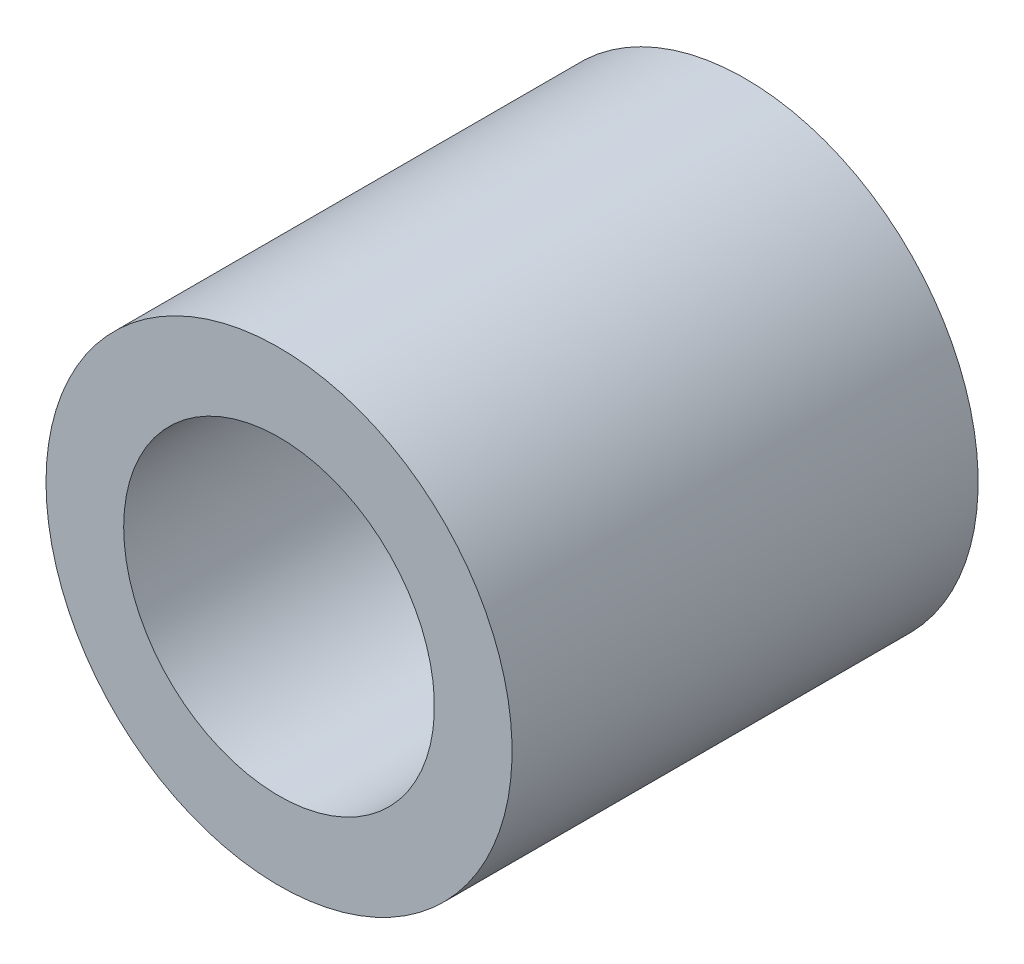
ISO-10303-21;
HEADER;
FILE_DESCRIPTION(('STEP AP214'),'2;1');
FILE_NAME('part.step','',(''),(''),'','','');
FILE_SCHEMA(('AUTOMOTIVE_DESIGN { 1 0 10303 214 1 1 1 1 }'));
ENDSEC;
DATA;
#1=APPLICATION_CONTEXT('core data for automotive mechanical design processes');
#2=APPLICATION_PROTOCOL_DEFINITION('international standard','automotive_design',2000,#1);
#3=PRODUCT_CONTEXT('',#1,'mechanical');
#4=PRODUCT('Part','Part','',(#3));
#5=PRODUCT_RELATED_PRODUCT_CATEGORY('part','',(#4));
#6=PRODUCT_DEFINITION_FORMATION('','',#4);
#7=PRODUCT_DEFINITION_CONTEXT('part definition',#1,'design');
#8=PRODUCT_DEFINITION('design','',#6,#7);
#9=PRODUCT_DEFINITION_SHAPE('','',#8);
#10=(LENGTH_UNIT() NAMED_UNIT(*) SI_UNIT(.MILLI.,.METRE.));
#11=(NAMED_UNIT(*) PLANE_ANGLE_UNIT() SI_UNIT($,.RADIAN.));
#12=(NAMED_UNIT(*) SI_UNIT($,.STERADIAN.) SOLID_ANGLE_UNIT());
#13=UNCERTAINTY_MEASURE_WITH_UNIT(LENGTH_MEASURE(1.E-05),#10,'distance_accuracy_value','');
#14=(GEOMETRIC_REPRESENTATION_CONTEXT(3) GLOBAL_UNCERTAINTY_ASSIGNED_CONTEXT((#13)) GLOBAL_UNIT_ASSIGNED_CONTEXT((#10,
#11,#12)) REPRESENTATION_CONTEXT('',''));
#15=CARTESIAN_POINT('',(0.,0.,0.));
#16=DIRECTION('',(0.,0.,1.));
#17=DIRECTION('',(1.,0.,0.));
#18=AXIS2_PLACEMENT_3D('',#15,#16,#17);
#19=CARTESIAN_POINT('',(0.,0.,38.1));
#20=DIRECTION('',(0.,0.,1.));
#21=DIRECTION('',(1.,0.,0.));
#22=AXIS2_PLACEMENT_3D('',#19,#20,#21);
#23=PLANE('',#22);
#24=CARTESIAN_POINT('',(0.,0.,38.1));
#25=DIRECTION('',(0.,0.,1.));
#26=DIRECTION('',(1.,0.,0.));
#27=AXIS2_PLACEMENT_3D('',#24,#25,#26);
#28=CIRCLE('',#27,19.05);
#29=CARTESIAN_POINT('',(-19.05,0.,38.1));
#30=VERTEX_POINT('',#29);
#31=EDGE_CURVE('E10',#30,#30,#28,.T.);
#32=ORIENTED_EDGE('',*,*,#31,.T.);
#33=EDGE_LOOP('',(#32));
#34=FACE_BOUND('',#33,.T.);
#35=CARTESIAN_POINT('',(0.,0.,38.1));
#36=DIRECTION('',(0.,0.,1.));
#37=DIRECTION('',(1.,0.,0.));
#38=AXIS2_PLACEMENT_3D('',#35,#36,#37);
#39=CIRCLE('',#38,12.7);
#40=CARTESIAN_POINT('',(-12.7,0.,38.1));
#41=VERTEX_POINT('',#40);
#42=EDGE_CURVE('E42',#41,#41,#39,.T.);
#43=ORIENTED_EDGE('',*,*,#42,.F.);
#44=EDGE_LOOP('',(#43));
#45=FACE_BOUND('',#44,.T.);
#46=ADVANCED_FACE('F31',(#34,#45),#23,.T.);
#47=CARTESIAN_POINT('',(0.,0.,0.));
#48=DIRECTION('',(0.,0.,1.));
#49=DIRECTION('',(1.,0.,0.));
#50=AXIS2_PLACEMENT_3D('',#47,#48,#49);
#51=PLANE('',#50);
#52=CARTESIAN_POINT('',(0.,0.,0.));
#53=DIRECTION('',(0.,0.,1.));
#54=DIRECTION('',(1.,0.,0.));
#55=AXIS2_PLACEMENT_3D('',#52,#53,#54);
#56=CIRCLE('',#55,19.05);
#57=CARTESIAN_POINT('',(-19.05,0.,0.));
#58=VERTEX_POINT('',#57);
#59=EDGE_CURVE('E35',#58,#58,#56,.T.);
#60=ORIENTED_EDGE('',*,*,#59,.F.);
#61=EDGE_LOOP('',(#60));
#62=FACE_BOUND('',#61,.T.);
#63=CARTESIAN_POINT('',(0.,0.,0.));
#64=DIRECTION('',(0.,0.,1.));
#65=DIRECTION('',(1.,0.,0.));
#66=AXIS2_PLACEMENT_3D('',#63,#64,#65);
#67=CIRCLE('',#66,12.7);
#68=CARTESIAN_POINT('',(-12.7,0.,0.));
#69=VERTEX_POINT('',#68);
#70=EDGE_CURVE('E44',#69,#69,#67,.T.);
#71=ORIENTED_EDGE('',*,*,#70,.T.);
#72=EDGE_LOOP('',(#71));
#73=FACE_BOUND('',#72,.T.);
#74=ADVANCED_FACE('F54',(#62,#73),#51,.F.);
#75=CARTESIAN_POINT('',(0.,0.,38.1));
#76=DIRECTION('',(0.,0.,-1.));
#77=DIRECTION('',(-1.,0.,0.));
#78=AXIS2_PLACEMENT_3D('',#75,#76,#77);
#79=CYLINDRICAL_SURFACE('',#78,19.05);
#80=CARTESIAN_POINT('',(-19.05,0.,38.1));
#81=CARTESIAN_POINT('',(-19.05,0.,37.703125));
#82=CARTESIAN_POINT('',(-19.05,0.,37.30625));
#83=CARTESIAN_POINT('',(-19.05,0.,36.5125));
#84=CARTESIAN_POINT('',(-19.05,0.,36.115625));
#85=CARTESIAN_POINT('',(-19.05,0.,35.321875));
#86=CARTESIAN_POINT('',(-19.05,0.,34.925));
#87=CARTESIAN_POINT('',(-19.05,0.,34.13125));
#88=CARTESIAN_POINT('',(-19.05,0.,33.734375));
#89=CARTESIAN_POINT('',(-19.05,0.,32.940625));
#90=CARTESIAN_POINT('',(-19.05,0.,32.54375));
#91=CARTESIAN_POINT('',(-19.05,0.,31.75));
#92=CARTESIAN_POINT('',(-19.05,0.,31.353125));
#93=CARTESIAN_POINT('',(-19.05,0.,30.559375));
#94=CARTESIAN_POINT('',(-19.05,0.,30.1625));
#95=CARTESIAN_POINT('',(-19.05,0.,29.36875));
#96=CARTESIAN_POINT('',(-19.05,0.,28.971875));
#97=CARTESIAN_POINT('',(-19.05,0.,28.178125));
#98=CARTESIAN_POINT('',(-19.05,0.,27.78125));
#99=CARTESIAN_POINT('',(-19.05,0.,26.9875));
#100=CARTESIAN_POINT('',(-19.05,0.,26.590625));
#101=CARTESIAN_POINT('',(-19.05,0.,25.796875));
#102=CARTESIAN_POINT('',(-19.05,0.,25.4));
#103=CARTESIAN_POINT('',(-19.05,0.,24.60625));
#104=CARTESIAN_POINT('',(-19.05,0.,24.209375));
#105=CARTESIAN_POINT('',(-19.05,0.,23.415625));
#106=CARTESIAN_POINT('',(-19.05,0.,23.01875));
#107=CARTESIAN_POINT('',(-19.05,0.,22.225));
#108=CARTESIAN_POINT('',(-19.05,0.,21.828125));
#109=CARTESIAN_POINT('',(-19.05,0.,21.034375));
#110=CARTESIAN_POINT('',(-19.05,0.,20.6375));
#111=CARTESIAN_POINT('',(-19.05,0.,19.84375));
#112=CARTESIAN_POINT('',(-19.05,0.,19.446875));
#113=CARTESIAN_POINT('',(-19.05,0.,18.653125));
#114=CARTESIAN_POINT('',(-19.05,0.,18.25625));
#115=CARTESIAN_POINT('',(-19.05,0.,17.4625));
#116=CARTESIAN_POINT('',(-19.05,0.,17.065625));
#117=CARTESIAN_POINT('',(-19.05,0.,16.271875));
#118=CARTESIAN_POINT('',(-19.05,0.,15.875));
#119=CARTESIAN_POINT('',(-19.05,0.,15.08125));
#120=CARTESIAN_POINT('',(-19.05,0.,14.684375));
#121=CARTESIAN_POINT('',(-19.05,0.,13.890625));
#122=CARTESIAN_POINT('',(-19.05,0.,13.49375));
#123=CARTESIAN_POINT('',(-19.05,0.,12.7));
#124=CARTESIAN_POINT('',(-19.05,0.,12.303125));
#125=CARTESIAN_POINT('',(-19.05,0.,11.509375));
#126=CARTESIAN_POINT('',(-19.05,0.,11.1125));
#127=CARTESIAN_POINT('',(-19.05,0.,10.31875));
#128=CARTESIAN_POINT('',(-19.05,0.,9.92187499999999));
#129=CARTESIAN_POINT('',(-19.05,0.,9.128125));
#130=CARTESIAN_POINT('',(-19.05,0.,8.73124999999999));
#131=CARTESIAN_POINT('',(-19.05,0.,7.93749999999999));
#132=CARTESIAN_POINT('',(-19.05,0.,7.54062499999999));
#133=CARTESIAN_POINT('',(-19.05,0.,6.746875));
#134=CARTESIAN_POINT('',(-19.05,0.,6.35));
#135=CARTESIAN_POINT('',(-19.05,0.,5.55625));
#136=CARTESIAN_POINT('',(-19.05,0.,5.159375));
#137=CARTESIAN_POINT('',(-19.05,0.,4.365625));
#138=CARTESIAN_POINT('',(-19.05,0.,3.96875));
#139=CARTESIAN_POINT('',(-19.05,0.,3.175));
#140=CARTESIAN_POINT('',(-19.05,0.,2.778125));
#141=CARTESIAN_POINT('',(-19.05,0.,1.984375));
#142=CARTESIAN_POINT('',(-19.05,0.,1.5875));
#143=CARTESIAN_POINT('',(-19.05,0.,0.79375));
#144=CARTESIAN_POINT('',(-19.05,0.,0.396875));
#145=CARTESIAN_POINT('',(-19.05,0.,0.));
#146=B_SPLINE_CURVE_WITH_KNOTS('',3,(#80,#81,#82,#83,#84,#85,#86,#87,#88,#89,#90,#91,#92,#93,
#94,#95,#96,#97,#98,#99,#100,#101,#102,#103,#104,#105,#106,#107,#108,#109,#110,#111,#112,#113,
#114,#115,#116,#117,#118,#119,#120,#121,#122,#123,#124,#125,#126,#127,#128,#129,#130,#131,#132,
#133,#134,#135,#136,#137,#138,#139,#140,#141,#142,#143,#144,#145),.UNSPECIFIED.,.F.,.F.,(4,2,2,
2,2,2,2,2,2,2,2,2,2,2,2,2,2,2,2,2,2,2,2,2,2,2,2,2,2,2,2,2,4),(0.,1.190625,2.38125,3.571875,
4.7625,5.953125,7.14375,8.334375,9.52500000000001,10.715625,11.90625,13.096875,14.2875,
15.478125,16.66875,17.859375,19.05,20.240625,21.43125,22.621875,23.8125,25.003125,26.19375,
27.384375,28.575,29.765625,30.95625,32.146875,33.3375,34.528125,35.71875,36.909375,38.1),.UNSPECIFIED.);
#147=EDGE_CURVE('BSEAM33',#30,#58,#146,.T.);
#148=ORIENTED_EDGE('',*,*,#31,.F.);
#149=ORIENTED_EDGE('',*,*,#59,.T.);
#150=ORIENTED_EDGE('',*,*,#147,.T.);
#151=ORIENTED_EDGE('',*,*,#147,.F.);
#152=EDGE_LOOP('',(#148,#150,#149,#151));
#153=FACE_BOUND('',#152,.T.);
#154=ADVANCED_FACE('F33',(#153),#79,.T.);
#155=CARTESIAN_POINT('',(0.,0.,38.1));
#156=DIRECTION('',(0.,0.,-1.));
#157=DIRECTION('',(-1.,0.,0.));
#158=AXIS2_PLACEMENT_3D('',#155,#156,#157);
#159=CYLINDRICAL_SURFACE('',#158,12.7);
#160=CARTESIAN_POINT('',(-12.7,0.,38.1));
#161=CARTESIAN_POINT('',(-12.7,0.,37.703125));
#162=CARTESIAN_POINT('',(-12.7,0.,37.30625));
#163=CARTESIAN_POINT('',(-12.7,0.,36.5125));
#164=CARTESIAN_POINT('',(-12.7,0.,36.115625));
#165=CARTESIAN_POINT('',(-12.7,0.,35.321875));
#166=CARTESIAN_POINT('',(-12.7,0.,34.925));
#167=CARTESIAN_POINT('',(-12.7,0.,34.13125));
#168=CARTESIAN_POINT('',(-12.7,0.,33.734375));
#169=CARTESIAN_POINT('',(-12.7,0.,32.940625));
#170=CARTESIAN_POINT('',(-12.7,0.,32.54375));
#171=CARTESIAN_POINT('',(-12.7,0.,31.75));
#172=CARTESIAN_POINT('',(-12.7,0.,31.353125));
#173=CARTESIAN_POINT('',(-12.7,0.,30.559375));
#174=CARTESIAN_POINT('',(-12.7,0.,30.1625));
#175=CARTESIAN_POINT('',(-12.7,0.,29.36875));
#176=CARTESIAN_POINT('',(-12.7,0.,28.971875));
#177=CARTESIAN_POINT('',(-12.7,0.,28.178125));
#178=CARTESIAN_POINT('',(-12.7,0.,27.78125));
#179=CARTESIAN_POINT('',(-12.7,0.,26.9875));
#180=CARTESIAN_POINT('',(-12.7,0.,26.590625));
#181=CARTESIAN_POINT('',(-12.7,0.,25.796875));
#182=CARTESIAN_POINT('',(-12.7,0.,25.4));
#183=CARTESIAN_POINT('',(-12.7,0.,24.60625));
#184=CARTESIAN_POINT('',(-12.7,0.,24.209375));
#185=CARTESIAN_POINT('',(-12.7,0.,23.415625));
#186=CARTESIAN_POINT('',(-12.7,0.,23.01875));
#187=CARTESIAN_POINT('',(-12.7,0.,22.225));
#188=CARTESIAN_POINT('',(-12.7,0.,21.828125));
#189=CARTESIAN_POINT('',(-12.7,0.,21.034375));
#190=CARTESIAN_POINT('',(-12.7,0.,20.6375));
#191=CARTESIAN_POINT('',(-12.7,0.,19.84375));
#192=CARTESIAN_POINT('',(-12.7,0.,19.446875));
#193=CARTESIAN_POINT('',(-12.7,0.,18.653125));
#194=CARTESIAN_POINT('',(-12.7,0.,18.25625));
#195=CARTESIAN_POINT('',(-12.7,0.,17.4625));
#196=CARTESIAN_POINT('',(-12.7,0.,17.065625));
#197=CARTESIAN_POINT('',(-12.7,0.,16.271875));
#198=CARTESIAN_POINT('',(-12.7,0.,15.875));
#199=CARTESIAN_POINT('',(-12.7,0.,15.08125));
#200=CARTESIAN_POINT('',(-12.7,0.,14.684375));
#201=CARTESIAN_POINT('',(-12.7,0.,13.890625));
#202=CARTESIAN_POINT('',(-12.7,0.,13.49375));
#203=CARTESIAN_POINT('',(-12.7,0.,12.7));
#204=CARTESIAN_POINT('',(-12.7,0.,12.303125));
#205=CARTESIAN_POINT('',(-12.7,0.,11.509375));
#206=CARTESIAN_POINT('',(-12.7,0.,11.1125));
#207=CARTESIAN_POINT('',(-12.7,0.,10.31875));
#208=CARTESIAN_POINT('',(-12.7,0.,9.92187499999999));
#209=CARTESIAN_POINT('',(-12.7,0.,9.128125));
#210=CARTESIAN_POINT('',(-12.7,0.,8.73124999999999));
#211=CARTESIAN_POINT('',(-12.7,0.,7.93749999999999));
#212=CARTESIAN_POINT('',(-12.7,0.,7.54062499999999));
#213=CARTESIAN_POINT('',(-12.7,0.,6.746875));
#214=CARTESIAN_POINT('',(-12.7,0.,6.35));
#215=CARTESIAN_POINT('',(-12.7,0.,5.55625));
#216=CARTESIAN_POINT('',(-12.7,0.,5.159375));
#217=CARTESIAN_POINT('',(-12.7,0.,4.365625));
#218=CARTESIAN_POINT('',(-12.7,0.,3.96875));
#219=CARTESIAN_POINT('',(-12.7,0.,3.175));
#220=CARTESIAN_POINT('',(-12.7,0.,2.778125));
#221=CARTESIAN_POINT('',(-12.7,0.,1.984375));
#222=CARTESIAN_POINT('',(-12.7,0.,1.5875));
#223=CARTESIAN_POINT('',(-12.7,0.,0.79375));
#224=CARTESIAN_POINT('',(-12.7,0.,0.396875));
#225=CARTESIAN_POINT('',(-12.7,0.,0.));
#226=B_SPLINE_CURVE_WITH_KNOTS('',3,(#160,#161,#162,#163,#164,#165,#166,#167,#168,#169,#170,
#171,#172,#173,#174,#175,#176,#177,#178,#179,#180,#181,#182,#183,#184,#185,#186,#187,#188,#189,
#190,#191,#192,#193,#194,#195,#196,#197,#198,#199,#200,#201,#202,#203,#204,#205,#206,#207,#208,
#209,#210,#211,#212,#213,#214,#215,#216,#217,#218,#219,#220,#221,#222,#223,#224,#225),
.UNSPECIFIED.,.F.,.F.,(4,2,2,2,2,2,2,2,2,2,2,2,2,2,2,2,2,2,2,2,2,2,2,2,2,2,2,2,2,2,2,2,4),(0.,
1.190625,2.38125,3.571875,4.7625,5.953125,7.14375,8.334375,9.52500000000001,10.715625,11.90625,
13.096875,14.2875,15.478125,16.66875,17.859375,19.05,20.240625,21.43125,22.621875,23.8125,
25.003125,26.19375,27.384375,28.575,29.765625,30.95625,32.146875,33.3375,34.528125,35.71875,
36.909375,38.1),.UNSPECIFIED.);
#227=EDGE_CURVE('BSEAM50',#41,#69,#226,.T.);
#228=ORIENTED_EDGE('',*,*,#42,.T.);
#229=ORIENTED_EDGE('',*,*,#70,.F.);
#230=ORIENTED_EDGE('',*,*,#227,.T.);
#231=ORIENTED_EDGE('',*,*,#227,.F.);
#232=EDGE_LOOP('',(#228,#230,#229,#231));
#233=FACE_BOUND('',#232,.T.);
#234=ADVANCED_FACE('F50',(#233),#159,.F.);
#235=CLOSED_SHELL('',(#46,#74,#154,#234));
#236=MANIFOLD_SOLID_BREP('B2',#235);
#237=ADVANCED_BREP_SHAPE_REPRESENTATION('',(#18,#236),#14);
#238=SHAPE_DEFINITION_REPRESENTATION(#9,#237);
ENDSEC;
END-ISO-10303-21;
